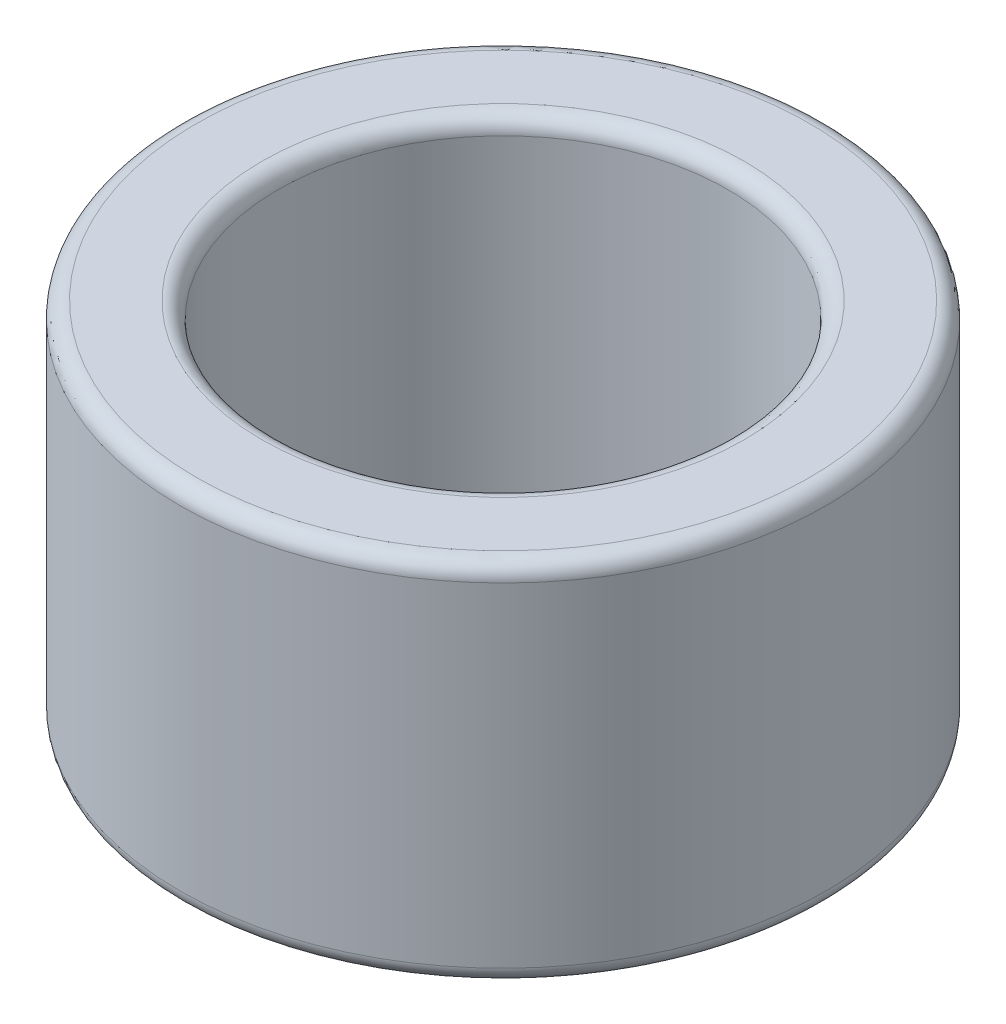
ISO-10303-21;
HEADER;
FILE_DESCRIPTION(('STEP AP214'),'2;1');
FILE_NAME('part.step','',(''),(''),'','','');
FILE_SCHEMA(('AUTOMOTIVE_DESIGN { 1 0 10303 214 1 1 1 1 }'));
ENDSEC;
DATA;
#1=APPLICATION_CONTEXT('core data for automotive mechanical design processes');
#2=APPLICATION_PROTOCOL_DEFINITION('international standard','automotive_design',2000,#1);
#3=PRODUCT_CONTEXT('',#1,'mechanical');
#4=PRODUCT('Part','Part','',(#3));
#5=PRODUCT_RELATED_PRODUCT_CATEGORY('part','',(#4));
#6=PRODUCT_DEFINITION_FORMATION('','',#4);
#7=PRODUCT_DEFINITION_CONTEXT('part definition',#1,'design');
#8=PRODUCT_DEFINITION('design','',#6,#7);
#9=PRODUCT_DEFINITION_SHAPE('','',#8);
#10=(LENGTH_UNIT() NAMED_UNIT(*) SI_UNIT(.MILLI.,.METRE.));
#11=(NAMED_UNIT(*) PLANE_ANGLE_UNIT() SI_UNIT($,.RADIAN.));
#12=(NAMED_UNIT(*) SI_UNIT($,.STERADIAN.) SOLID_ANGLE_UNIT());
#13=UNCERTAINTY_MEASURE_WITH_UNIT(LENGTH_MEASURE(1.E-05),#10,'distance_accuracy_value','');
#14=(GEOMETRIC_REPRESENTATION_CONTEXT(3) GLOBAL_UNCERTAINTY_ASSIGNED_CONTEXT((#13)) GLOBAL_UNIT_ASSIGNED_CONTEXT((#10,
#11,#12)) REPRESENTATION_CONTEXT('',''));
#15=CARTESIAN_POINT('',(0.,0.,0.));
#16=DIRECTION('',(0.,0.,1.));
#17=DIRECTION('',(1.,0.,0.));
#18=AXIS2_PLACEMENT_3D('',#15,#16,#17);
#19=CARTESIAN_POINT('',(0.,4.48,0.));
#20=DIRECTION('',(0.,-1.,0.));
#21=DIRECTION('',(0.,0.,-1.));
#22=AXIS2_PLACEMENT_3D('',#19,#20,#21);
#23=CYLINDRICAL_SURFACE('',#22,3.95);
#24=CARTESIAN_POINT('',(0.,0.2,0.));
#25=DIRECTION('',(0.,1.,0.));
#26=DIRECTION('',(0.,0.,1.));
#27=AXIS2_PLACEMENT_3D('',#24,#25,#26);
#28=CIRCLE('',#27,3.95);
#29=CARTESIAN_POINT('',(0.,0.2,3.95));
#30=VERTEX_POINT('',#29);
#31=EDGE_CURVE('E50',#30,#30,#28,.T.);
#32=ORIENTED_EDGE('',*,*,#31,.T.);
#33=EDGE_LOOP('',(#32));
#34=FACE_BOUND('',#33,.T.);
#35=CARTESIAN_POINT('',(0.,4.28,0.));
#36=DIRECTION('',(0.,1.,0.));
#37=DIRECTION('',(0.,0.,1.));
#38=AXIS2_PLACEMENT_3D('',#35,#36,#37);
#39=CIRCLE('',#38,3.95);
#40=CARTESIAN_POINT('',(0.,4.28,3.95));
#41=VERTEX_POINT('',#40);
#42=EDGE_CURVE('E54',#41,#41,#39,.F.);
#43=ORIENTED_EDGE('',*,*,#42,.T.);
#44=EDGE_LOOP('',(#43));
#45=FACE_BOUND('',#44,.T.);
#46=ADVANCED_FACE('F39',(#34,#45),#23,.T.);
#47=CARTESIAN_POINT('',(0.,4.48,0.));
#48=DIRECTION('',(0.,1.,0.));
#49=DIRECTION('',(0.,0.,1.));
#50=AXIS2_PLACEMENT_3D('',#47,#48,#49);
#51=PLANE('',#50);
#52=CARTESIAN_POINT('',(0.,4.48,0.));
#53=DIRECTION('',(0.,1.,0.));
#54=DIRECTION('',(0.,0.,1.));
#55=AXIS2_PLACEMENT_3D('',#52,#53,#54);
#56=CIRCLE('',#55,3.75);
#57=CARTESIAN_POINT('',(0.,4.48,3.75));
#58=VERTEX_POINT('',#57);
#59=EDGE_CURVE('E10',#58,#58,#56,.T.);
#60=ORIENTED_EDGE('',*,*,#59,.T.);
#61=EDGE_LOOP('',(#60));
#62=FACE_BOUND('',#61,.T.);
#63=CARTESIAN_POINT('',(0.,4.48,0.));
#64=DIRECTION('',(0.,1.,0.));
#65=DIRECTION('',(0.,0.,1.));
#66=AXIS2_PLACEMENT_3D('',#63,#64,#65);
#67=CIRCLE('',#66,2.94999999999999);
#68=CARTESIAN_POINT('',(0.,4.48,2.94999999999999));
#69=VERTEX_POINT('',#68);
#70=EDGE_CURVE('E46',#69,#69,#67,.F.);
#71=ORIENTED_EDGE('',*,*,#70,.T.);
#72=EDGE_LOOP('',(#71));
#73=FACE_BOUND('',#72,.T.);
#74=ADVANCED_FACE('F83',(#62,#73),#51,.T.);
#75=CARTESIAN_POINT('',(0.,0.,0.));
#76=DIRECTION('',(0.,1.,0.));
#77=DIRECTION('',(0.,0.,1.));
#78=AXIS2_PLACEMENT_3D('',#75,#76,#77);
#79=PLANE('',#78);
#80=CARTESIAN_POINT('',(0.,0.,0.));
#81=DIRECTION('',(0.,1.,0.));
#82=DIRECTION('',(0.,0.,1.));
#83=AXIS2_PLACEMENT_3D('',#80,#81,#82);
#84=CIRCLE('',#83,2.94999999999999);
#85=CARTESIAN_POINT('',(0.,0.,2.94999999999999));
#86=VERTEX_POINT('',#85);
#87=EDGE_CURVE('E59',#86,#86,#84,.T.);
#88=ORIENTED_EDGE('',*,*,#87,.T.);
#89=EDGE_LOOP('',(#88));
#90=FACE_BOUND('',#89,.T.);
#91=CARTESIAN_POINT('',(0.,0.,0.));
#92=DIRECTION('',(0.,1.,0.));
#93=DIRECTION('',(0.,0.,1.));
#94=AXIS2_PLACEMENT_3D('',#91,#92,#93);
#95=CIRCLE('',#94,3.75);
#96=CARTESIAN_POINT('',(0.,0.,3.75));
#97=VERTEX_POINT('',#96);
#98=EDGE_CURVE('E62',#97,#97,#95,.F.);
#99=ORIENTED_EDGE('',*,*,#98,.T.);
#100=EDGE_LOOP('',(#99));
#101=FACE_BOUND('',#100,.T.);
#102=ADVANCED_FACE('F89',(#90,#101),#79,.F.);
#103=CARTESIAN_POINT('',(0.,4.48,0.));
#104=DIRECTION('',(0.,1.,0.));
#105=DIRECTION('',(0.,0.,1.));
#106=AXIS2_PLACEMENT_3D('',#103,#104,#105);
#107=CYLINDRICAL_SURFACE('',#106,2.74999999999999);
#108=CARTESIAN_POINT('',(0.,0.2,0.));
#109=DIRECTION('',(0.,1.,0.));
#110=DIRECTION('',(0.,0.,1.));
#111=AXIS2_PLACEMENT_3D('',#108,#109,#110);
#112=CIRCLE('',#111,2.74999999999999);
#113=CARTESIAN_POINT('',(0.,0.2,2.74999999999999));
#114=VERTEX_POINT('',#113);
#115=EDGE_CURVE('E65',#114,#114,#112,.F.);
#116=ORIENTED_EDGE('',*,*,#115,.T.);
#117=EDGE_LOOP('',(#116));
#118=FACE_BOUND('',#117,.T.);
#119=CARTESIAN_POINT('',(0.,4.28,0.));
#120=DIRECTION('',(0.,1.,0.));
#121=DIRECTION('',(0.,0.,1.));
#122=AXIS2_PLACEMENT_3D('',#119,#120,#121);
#123=CIRCLE('',#122,2.74999999999999);
#124=CARTESIAN_POINT('',(0.,4.28,2.74999999999999));
#125=VERTEX_POINT('',#124);
#126=EDGE_CURVE('E68',#125,#125,#123,.T.);
#127=ORIENTED_EDGE('',*,*,#126,.T.);
#128=EDGE_LOOP('',(#127));
#129=FACE_BOUND('',#128,.T.);
#130=ADVANCED_FACE('F72',(#118,#129),#107,.F.);
#131=CARTESIAN_POINT('',(0.,0.2,0.));
#132=DIRECTION('',(0.,1.,0.));
#133=DIRECTION('',(0.,0.,1.));
#134=AXIS2_PLACEMENT_3D('',#131,#132,#133);
#135=TOROIDAL_SURFACE('',#134,2.94999999999999,0.2);
#136=ORIENTED_EDGE('',*,*,#87,.F.);
#137=EDGE_LOOP('',(#136));
#138=FACE_BOUND('',#137,.T.);
#139=ORIENTED_EDGE('',*,*,#115,.F.);
#140=EDGE_LOOP('',(#139));
#141=FACE_BOUND('',#140,.T.);
#142=ADVANCED_FACE('F94',(#138,#141),#135,.T.);
#143=CARTESIAN_POINT('',(0.,0.2,0.));
#144=DIRECTION('',(0.,1.,0.));
#145=DIRECTION('',(0.,0.,1.));
#146=AXIS2_PLACEMENT_3D('',#143,#144,#145);
#147=TOROIDAL_SURFACE('',#146,3.75,0.2);
#148=ORIENTED_EDGE('',*,*,#98,.F.);
#149=EDGE_LOOP('',(#148));
#150=FACE_BOUND('',#149,.T.);
#151=ORIENTED_EDGE('',*,*,#31,.F.);
#152=EDGE_LOOP('',(#151));
#153=FACE_BOUND('',#152,.T.);
#154=ADVANCED_FACE('F80',(#150,#153),#147,.T.);
#155=CARTESIAN_POINT('',(0.,4.28,0.));
#156=DIRECTION('',(0.,1.,0.));
#157=DIRECTION('',(0.,0.,1.));
#158=AXIS2_PLACEMENT_3D('',#155,#156,#157);
#159=TOROIDAL_SURFACE('',#158,3.75,0.2);
#160=ORIENTED_EDGE('',*,*,#42,.F.);
#161=EDGE_LOOP('',(#160));
#162=FACE_BOUND('',#161,.T.);
#163=ORIENTED_EDGE('',*,*,#59,.F.);
#164=EDGE_LOOP('',(#163));
#165=FACE_BOUND('',#164,.T.);
#166=ADVANCED_FACE('F75',(#162,#165),#159,.T.);
#167=CARTESIAN_POINT('',(0.,4.28,0.));
#168=DIRECTION('',(0.,1.,0.));
#169=DIRECTION('',(0.,0.,1.));
#170=AXIS2_PLACEMENT_3D('',#167,#168,#169);
#171=TOROIDAL_SURFACE('',#170,2.94999999999999,0.2);
#172=ORIENTED_EDGE('',*,*,#70,.F.);
#173=EDGE_LOOP('',(#172));
#174=FACE_BOUND('',#173,.T.);
#175=ORIENTED_EDGE('',*,*,#126,.F.);
#176=EDGE_LOOP('',(#175));
#177=FACE_BOUND('',#176,.T.);
#178=ADVANCED_FACE('F41',(#174,#177),#171,.T.);
#179=CLOSED_SHELL('',(#46,#74,#102,#130,#142,#154,#166,#178));
#180=MANIFOLD_SOLID_BREP('B2',#179);
#181=ADVANCED_BREP_SHAPE_REPRESENTATION('',(#18,#180),#14);
#182=SHAPE_DEFINITION_REPRESENTATION(#9,#181);
ENDSEC;
END-ISO-10303-21;
